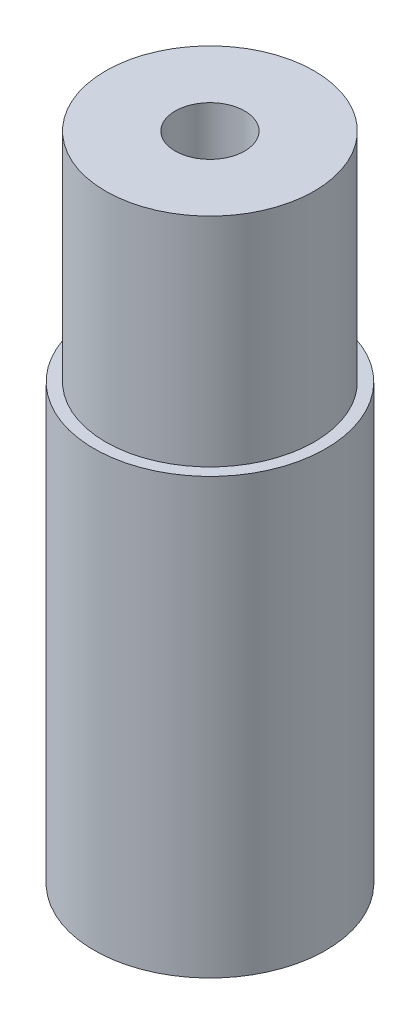
ISO-10303-21;
HEADER;
FILE_DESCRIPTION(('STEP AP214'),'2;1');
FILE_NAME('part.step','',(''),(''),'','','');
FILE_SCHEMA(('AUTOMOTIVE_DESIGN { 1 0 10303 214 1 1 1 1 }'));
ENDSEC;
DATA;
#1=APPLICATION_CONTEXT('core data for automotive mechanical design processes');
#2=APPLICATION_PROTOCOL_DEFINITION('international standard','automotive_design',2000,#1);
#3=PRODUCT_CONTEXT('',#1,'mechanical');
#4=PRODUCT('Part','Part','',(#3));
#5=PRODUCT_RELATED_PRODUCT_CATEGORY('part','',(#4));
#6=PRODUCT_DEFINITION_FORMATION('','',#4);
#7=PRODUCT_DEFINITION_CONTEXT('part definition',#1,'design');
#8=PRODUCT_DEFINITION('design','',#6,#7);
#9=PRODUCT_DEFINITION_SHAPE('','',#8);
#10=(LENGTH_UNIT() NAMED_UNIT(*) SI_UNIT(.MILLI.,.METRE.));
#11=(NAMED_UNIT(*) PLANE_ANGLE_UNIT() SI_UNIT($,.RADIAN.));
#12=(NAMED_UNIT(*) SI_UNIT($,.STERADIAN.) SOLID_ANGLE_UNIT());
#13=UNCERTAINTY_MEASURE_WITH_UNIT(LENGTH_MEASURE(1.E-05),#10,'distance_accuracy_value','');
#14=(GEOMETRIC_REPRESENTATION_CONTEXT(3) GLOBAL_UNCERTAINTY_ASSIGNED_CONTEXT((#13)) GLOBAL_UNIT_ASSIGNED_CONTEXT((#10,
#11,#12)) REPRESENTATION_CONTEXT('',''));
#15=CARTESIAN_POINT('',(0.,0.,0.));
#16=DIRECTION('',(0.,0.,1.));
#17=DIRECTION('',(1.,0.,0.));
#18=AXIS2_PLACEMENT_3D('',#15,#16,#17);
#19=CARTESIAN_POINT('',(0.,19.05,0.));
#20=DIRECTION('',(0.,-1.,0.));
#21=DIRECTION('',(0.,0.,-1.));
#22=AXIS2_PLACEMENT_3D('',#19,#20,#21);
#23=CYLINDRICAL_SURFACE('',#22,5.08);
#24=CARTESIAN_POINT('',(0.,19.05,0.));
#25=DIRECTION('',(0.,1.,0.));
#26=DIRECTION('',(0.,0.,1.));
#27=AXIS2_PLACEMENT_3D('',#24,#25,#26);
#28=CIRCLE('',#27,5.08);
#29=CARTESIAN_POINT('',(0.,19.05,-5.08));
#30=VERTEX_POINT('',#29);
#31=EDGE_CURVE('E41',#30,#30,#28,.T.);
#32=CARTESIAN_POINT('',(0.,0.,0.));
#33=DIRECTION('',(0.,1.,0.));
#34=DIRECTION('',(0.,0.,1.));
#35=AXIS2_PLACEMENT_3D('',#32,#33,#34);
#36=CIRCLE('',#35,5.08);
#37=CARTESIAN_POINT('',(0.,0.,-5.08));
#38=VERTEX_POINT('',#37);
#39=EDGE_CURVE('E37',#38,#38,#36,.T.);
#40=CARTESIAN_POINT('',(0.,19.05,-5.08));
#41=CARTESIAN_POINT('',(0.,18.8515625,-5.08));
#42=CARTESIAN_POINT('',(0.,18.653125,-5.08));
#43=CARTESIAN_POINT('',(0.,18.25625,-5.08));
#44=CARTESIAN_POINT('',(0.,18.0578125,-5.08));
#45=CARTESIAN_POINT('',(0.,17.6609375,-5.08));
#46=CARTESIAN_POINT('',(0.,17.4625,-5.08));
#47=CARTESIAN_POINT('',(0.,17.065625,-5.08));
#48=CARTESIAN_POINT('',(0.,16.8671875,-5.08));
#49=CARTESIAN_POINT('',(0.,16.4703125,-5.08));
#50=CARTESIAN_POINT('',(0.,16.271875,-5.08));
#51=CARTESIAN_POINT('',(0.,15.875,-5.08));
#52=CARTESIAN_POINT('',(0.,15.6765625,-5.08));
#53=CARTESIAN_POINT('',(0.,15.2796875,-5.08));
#54=CARTESIAN_POINT('',(0.,15.08125,-5.08));
#55=CARTESIAN_POINT('',(0.,14.684375,-5.08));
#56=CARTESIAN_POINT('',(0.,14.4859375,-5.08));
#57=CARTESIAN_POINT('',(0.,14.0890625,-5.08));
#58=CARTESIAN_POINT('',(0.,13.890625,-5.08));
#59=CARTESIAN_POINT('',(0.,13.49375,-5.08));
#60=CARTESIAN_POINT('',(0.,13.2953125,-5.08));
#61=CARTESIAN_POINT('',(0.,12.8984375,-5.08));
#62=CARTESIAN_POINT('',(0.,12.7,-5.08));
#63=CARTESIAN_POINT('',(0.,12.303125,-5.08));
#64=CARTESIAN_POINT('',(0.,12.1046875,-5.08));
#65=CARTESIAN_POINT('',(0.,11.7078125,-5.08));
#66=CARTESIAN_POINT('',(0.,11.509375,-5.08));
#67=CARTESIAN_POINT('',(0.,11.1125,-5.08));
#68=CARTESIAN_POINT('',(0.,10.9140625,-5.08));
#69=CARTESIAN_POINT('',(0.,10.5171875,-5.08));
#70=CARTESIAN_POINT('',(0.,10.31875,-5.08));
#71=CARTESIAN_POINT('',(0.,9.921875,-5.08));
#72=CARTESIAN_POINT('',(0.,9.7234375,-5.08));
#73=CARTESIAN_POINT('',(0.,9.3265625,-5.08));
#74=CARTESIAN_POINT('',(0.,9.128125,-5.08));
#75=CARTESIAN_POINT('',(0.,8.73125,-5.08));
#76=CARTESIAN_POINT('',(0.,8.5328125,-5.08));
#77=CARTESIAN_POINT('',(0.,8.1359375,-5.08));
#78=CARTESIAN_POINT('',(0.,7.9375,-5.08));
#79=CARTESIAN_POINT('',(0.,7.540625,-5.08));
#80=CARTESIAN_POINT('',(0.,7.3421875,-5.08));
#81=CARTESIAN_POINT('',(0.,6.9453125,-5.08));
#82=CARTESIAN_POINT('',(0.,6.746875,-5.08));
#83=CARTESIAN_POINT('',(0.,6.35,-5.08));
#84=CARTESIAN_POINT('',(0.,6.1515625,-5.08));
#85=CARTESIAN_POINT('',(0.,5.7546875,-5.08));
#86=CARTESIAN_POINT('',(0.,5.55625,-5.08));
#87=CARTESIAN_POINT('',(0.,5.159375,-5.08));
#88=CARTESIAN_POINT('',(0.,4.9609375,-5.08));
#89=CARTESIAN_POINT('',(0.,4.5640625,-5.08));
#90=CARTESIAN_POINT('',(0.,4.365625,-5.08));
#91=CARTESIAN_POINT('',(0.,3.96875,-5.08));
#92=CARTESIAN_POINT('',(0.,3.7703125,-5.08));
#93=CARTESIAN_POINT('',(0.,3.3734375,-5.08));
#94=CARTESIAN_POINT('',(0.,3.175,-5.08));
#95=CARTESIAN_POINT('',(0.,2.778125,-5.08));
#96=CARTESIAN_POINT('',(0.,2.5796875,-5.08));
#97=CARTESIAN_POINT('',(0.,2.1828125,-5.08));
#98=CARTESIAN_POINT('',(0.,1.984375,-5.08));
#99=CARTESIAN_POINT('',(0.,1.5875,-5.08));
#100=CARTESIAN_POINT('',(0.,1.3890625,-5.08));
#101=CARTESIAN_POINT('',(0.,0.992187500000001,-5.08));
#102=CARTESIAN_POINT('',(0.,0.793750000000001,-5.08));
#103=CARTESIAN_POINT('',(0.,0.396875,-5.08));
#104=CARTESIAN_POINT('',(0.,0.1984375,-5.08));
#105=CARTESIAN_POINT('',(0.,0.,-5.08));
#106=B_SPLINE_CURVE_WITH_KNOTS('',3,(#40,#41,#42,#43,#44,#45,#46,#47,#48,#49,#50,#51,#52,#53,
#54,#55,#56,#57,#58,#59,#60,#61,#62,#63,#64,#65,#66,#67,#68,#69,#70,#71,#72,#73,#74,#75,#76,#77,
#78,#79,#80,#81,#82,#83,#84,#85,#86,#87,#88,#89,#90,#91,#92,#93,#94,#95,#96,#97,#98,#99,#100,
#101,#102,#103,#104,#105),.UNSPECIFIED.,.F.,.F.,(4,2,2,2,2,2,2,2,2,2,2,2,2,2,2,2,2,2,2,2,2,2,2,
2,2,2,2,2,2,2,2,2,4),(0.,0.595312499999997,1.190625,1.7859375,2.38125,2.9765625,3.571875,
4.1671875,4.7625,5.3578125,5.953125,6.5484375,7.14375,7.7390625,8.334375,8.9296875,9.525,
10.1203125,10.715625,11.3109375,11.90625,12.5015625,13.096875,13.6921875,14.2875,14.8828125,
15.478125,16.0734375,16.66875,17.2640625,17.859375,18.4546875,19.05),.UNSPECIFIED.);
#107=EDGE_CURVE('BSEAM34',#30,#38,#106,.T.);
#108=ORIENTED_EDGE('',*,*,#31,.F.);
#109=ORIENTED_EDGE('',*,*,#39,.T.);
#110=ORIENTED_EDGE('',*,*,#107,.T.);
#111=ORIENTED_EDGE('',*,*,#107,.F.);
#112=EDGE_LOOP('',(#108,#110,#109,#111));
#113=FACE_BOUND('',#112,.T.);
#114=ADVANCED_FACE('F34',(#113),#23,.T.);
#115=CARTESIAN_POINT('',(0.,19.05,0.));
#116=DIRECTION('',(0.,1.,0.));
#117=DIRECTION('',(0.,0.,1.));
#118=AXIS2_PLACEMENT_3D('',#115,#116,#117);
#119=PLANE('',#118);
#120=CARTESIAN_POINT('',(0.,19.05,0.));
#121=DIRECTION('',(0.,1.,0.));
#122=DIRECTION('',(0.,0.,1.));
#123=AXIS2_PLACEMENT_3D('',#120,#121,#122);
#124=CIRCLE('',#123,4.572);
#125=CARTESIAN_POINT('',(0.,19.05,-4.572));
#126=VERTEX_POINT('',#125);
#127=EDGE_CURVE('E10',#126,#126,#124,.T.);
#128=ORIENTED_EDGE('',*,*,#127,.F.);
#129=EDGE_LOOP('',(#128));
#130=FACE_BOUND('',#129,.T.);
#131=ORIENTED_EDGE('',*,*,#31,.T.);
#132=EDGE_LOOP('',(#131));
#133=FACE_BOUND('',#132,.T.);
#134=ADVANCED_FACE('F78',(#130,#133),#119,.T.);
#135=CARTESIAN_POINT('',(0.,0.,0.));
#136=DIRECTION('',(0.,1.,0.));
#137=DIRECTION('',(0.,0.,1.));
#138=AXIS2_PLACEMENT_3D('',#135,#136,#137);
#139=PLANE('',#138);
#140=ORIENTED_EDGE('',*,*,#39,.F.);
#141=EDGE_LOOP('',(#140));
#142=FACE_BOUND('',#141,.T.);
#143=ADVANCED_FACE('F73',(#142),#139,.F.);
#144=CARTESIAN_POINT('',(0.,28.575,0.));
#145=DIRECTION('',(0.,-1.,0.));
#146=DIRECTION('',(0.,0.,-1.));
#147=AXIS2_PLACEMENT_3D('',#144,#145,#146);
#148=CYLINDRICAL_SURFACE('',#147,4.572);
#149=CARTESIAN_POINT('',(0.,28.575,0.));
#150=DIRECTION('',(0.,1.,0.));
#151=DIRECTION('',(0.,0.,1.));
#152=AXIS2_PLACEMENT_3D('',#149,#150,#151);
#153=CIRCLE('',#152,4.572);
#154=CARTESIAN_POINT('',(0.,28.575,-4.572));
#155=VERTEX_POINT('',#154);
#156=EDGE_CURVE('E47',#155,#155,#153,.T.);
#157=CARTESIAN_POINT('',(0.,28.575,-4.572));
#158=CARTESIAN_POINT('',(0.,28.47578125,-4.572));
#159=CARTESIAN_POINT('',(0.,28.3765625,-4.572));
#160=CARTESIAN_POINT('',(0.,28.178125,-4.572));
#161=CARTESIAN_POINT('',(0.,28.07890625,-4.572));
#162=CARTESIAN_POINT('',(0.,27.88046875,-4.572));
#163=CARTESIAN_POINT('',(0.,27.78125,-4.572));
#164=CARTESIAN_POINT('',(0.,27.5828125,-4.572));
#165=CARTESIAN_POINT('',(0.,27.48359375,-4.572));
#166=CARTESIAN_POINT('',(0.,27.28515625,-4.572));
#167=CARTESIAN_POINT('',(0.,27.1859375,-4.572));
#168=CARTESIAN_POINT('',(0.,26.9875,-4.572));
#169=CARTESIAN_POINT('',(0.,26.88828125,-4.572));
#170=CARTESIAN_POINT('',(0.,26.68984375,-4.572));
#171=CARTESIAN_POINT('',(0.,26.590625,-4.572));
#172=CARTESIAN_POINT('',(0.,26.3921875,-4.572));
#173=CARTESIAN_POINT('',(0.,26.29296875,-4.572));
#174=CARTESIAN_POINT('',(0.,26.09453125,-4.572));
#175=CARTESIAN_POINT('',(0.,25.9953125,-4.572));
#176=CARTESIAN_POINT('',(0.,25.796875,-4.572));
#177=CARTESIAN_POINT('',(0.,25.69765625,-4.572));
#178=CARTESIAN_POINT('',(0.,25.49921875,-4.572));
#179=CARTESIAN_POINT('',(0.,25.4,-4.572));
#180=CARTESIAN_POINT('',(0.,25.2015625,-4.572));
#181=CARTESIAN_POINT('',(0.,25.10234375,-4.572));
#182=CARTESIAN_POINT('',(0.,24.90390625,-4.572));
#183=CARTESIAN_POINT('',(0.,24.8046875,-4.572));
#184=CARTESIAN_POINT('',(0.,24.60625,-4.572));
#185=CARTESIAN_POINT('',(0.,24.50703125,-4.572));
#186=CARTESIAN_POINT('',(0.,24.30859375,-4.572));
#187=CARTESIAN_POINT('',(0.,24.209375,-4.572));
#188=CARTESIAN_POINT('',(0.,24.0109375,-4.572));
#189=CARTESIAN_POINT('',(0.,23.91171875,-4.572));
#190=CARTESIAN_POINT('',(0.,23.71328125,-4.572));
#191=CARTESIAN_POINT('',(0.,23.6140625,-4.572));
#192=CARTESIAN_POINT('',(0.,23.415625,-4.572));
#193=CARTESIAN_POINT('',(0.,23.31640625,-4.572));
#194=CARTESIAN_POINT('',(0.,23.11796875,-4.572));
#195=CARTESIAN_POINT('',(0.,23.01875,-4.572));
#196=CARTESIAN_POINT('',(0.,22.8203125,-4.572));
#197=CARTESIAN_POINT('',(0.,22.72109375,-4.572));
#198=CARTESIAN_POINT('',(0.,22.52265625,-4.572));
#199=CARTESIAN_POINT('',(0.,22.4234375,-4.572));
#200=CARTESIAN_POINT('',(0.,22.225,-4.572));
#201=CARTESIAN_POINT('',(0.,22.12578125,-4.572));
#202=CARTESIAN_POINT('',(0.,21.92734375,-4.572));
#203=CARTESIAN_POINT('',(0.,21.828125,-4.572));
#204=CARTESIAN_POINT('',(0.,21.6296875,-4.572));
#205=CARTESIAN_POINT('',(0.,21.53046875,-4.572));
#206=CARTESIAN_POINT('',(0.,21.33203125,-4.572));
#207=CARTESIAN_POINT('',(0.,21.2328125,-4.572));
#208=CARTESIAN_POINT('',(0.,21.034375,-4.572));
#209=CARTESIAN_POINT('',(0.,20.93515625,-4.572));
#210=CARTESIAN_POINT('',(0.,20.73671875,-4.572));
#211=CARTESIAN_POINT('',(0.,20.6375,-4.572));
#212=CARTESIAN_POINT('',(0.,20.4390625,-4.572));
#213=CARTESIAN_POINT('',(0.,20.33984375,-4.572));
#214=CARTESIAN_POINT('',(0.,20.14140625,-4.572));
#215=CARTESIAN_POINT('',(0.,20.0421875,-4.572));
#216=CARTESIAN_POINT('',(0.,19.84375,-4.572));
#217=CARTESIAN_POINT('',(0.,19.74453125,-4.572));
#218=CARTESIAN_POINT('',(0.,19.54609375,-4.572));
#219=CARTESIAN_POINT('',(0.,19.446875,-4.572));
#220=CARTESIAN_POINT('',(0.,19.2484375,-4.572));
#221=CARTESIAN_POINT('',(0.,19.14921875,-4.572));
#222=CARTESIAN_POINT('',(0.,19.05,-4.572));
#223=B_SPLINE_CURVE_WITH_KNOTS('',3,(#157,#158,#159,#160,#161,#162,#163,#164,#165,#166,#167,
#168,#169,#170,#171,#172,#173,#174,#175,#176,#177,#178,#179,#180,#181,#182,#183,#184,#185,#186,
#187,#188,#189,#190,#191,#192,#193,#194,#195,#196,#197,#198,#199,#200,#201,#202,#203,#204,#205,
#206,#207,#208,#209,#210,#211,#212,#213,#214,#215,#216,#217,#218,#219,#220,#221,#222),
.UNSPECIFIED.,.F.,.F.,(4,2,2,2,2,2,2,2,2,2,2,2,2,2,2,2,2,2,2,2,2,2,2,2,2,2,2,2,2,2,2,2,4),(0.,
0.297656249999997,0.595312499999997,0.892968749999997,1.190625,1.48828125,1.7859375,2.08359375,
2.38125,2.67890625,2.9765625,3.27421875,3.571875,3.86953125,4.1671875,4.46484375,4.7625,
5.06015625,5.3578125,5.65546875,5.953125,6.25078125,6.5484375,6.84609375,7.14375,7.44140625,
7.7390625,8.03671875,8.334375,8.63203125,8.9296875,9.22734375,9.525),.UNSPECIFIED.);
#224=EDGE_CURVE('BSEAM68',#155,#126,#223,.T.);
#225=ORIENTED_EDGE('',*,*,#156,.F.);
#226=ORIENTED_EDGE('',*,*,#127,.T.);
#227=ORIENTED_EDGE('',*,*,#224,.T.);
#228=ORIENTED_EDGE('',*,*,#224,.F.);
#229=EDGE_LOOP('',(#225,#227,#226,#228));
#230=FACE_BOUND('',#229,.T.);
#231=ADVANCED_FACE('F68',(#230),#148,.T.);
#232=CARTESIAN_POINT('',(0.,28.575,0.));
#233=DIRECTION('',(0.,1.,0.));
#234=DIRECTION('',(0.,0.,1.));
#235=AXIS2_PLACEMENT_3D('',#232,#233,#234);
#236=PLANE('',#235);
#237=CARTESIAN_POINT('',(0.,28.575,0.));
#238=DIRECTION('',(0.,1.,0.));
#239=DIRECTION('',(0.,0.,1.));
#240=AXIS2_PLACEMENT_3D('',#237,#238,#239);
#241=CIRCLE('',#240,1.524);
#242=CARTESIAN_POINT('',(0.,28.575,1.524));
#243=VERTEX_POINT('',#242);
#244=EDGE_CURVE('E51',#243,#243,#241,.T.);
#245=ORIENTED_EDGE('',*,*,#244,.F.);
#246=EDGE_LOOP('',(#245));
#247=FACE_BOUND('',#246,.T.);
#248=ORIENTED_EDGE('',*,*,#156,.T.);
#249=EDGE_LOOP('',(#248));
#250=FACE_BOUND('',#249,.T.);
#251=ADVANCED_FACE('F62',(#247,#250),#236,.T.);
#252=CARTESIAN_POINT('',(0.,23.876,0.));
#253=DIRECTION('',(0.,1.,0.));
#254=DIRECTION('',(0.,0.,1.));
#255=AXIS2_PLACEMENT_3D('',#252,#253,#254);
#256=CYLINDRICAL_SURFACE('',#255,1.524);
#257=CARTESIAN_POINT('',(0.,23.876,0.));
#258=DIRECTION('',(0.,1.,0.));
#259=DIRECTION('',(0.,0.,1.));
#260=AXIS2_PLACEMENT_3D('',#257,#258,#259);
#261=CIRCLE('',#260,1.524);
#262=CARTESIAN_POINT('',(0.,23.876,1.524));
#263=VERTEX_POINT('',#262);
#264=EDGE_CURVE('E50',#263,#263,#261,.T.);
#265=ORIENTED_EDGE('',*,*,#264,.F.);
#266=EDGE_LOOP('',(#265));
#267=FACE_BOUND('',#266,.T.);
#268=ORIENTED_EDGE('',*,*,#244,.T.);
#269=EDGE_LOOP('',(#268));
#270=FACE_BOUND('',#269,.T.);
#271=ADVANCED_FACE('F59',(#267,#270),#256,.F.);
#272=CARTESIAN_POINT('',(0.,23.876,0.));
#273=DIRECTION('',(0.,1.,0.));
#274=DIRECTION('',(0.,0.,1.));
#275=AXIS2_PLACEMENT_3D('',#272,#273,#274);
#276=PLANE('',#275);
#277=ORIENTED_EDGE('',*,*,#264,.T.);
#278=EDGE_LOOP('',(#277));
#279=FACE_BOUND('',#278,.T.);
#280=ADVANCED_FACE('F57',(#279),#276,.T.);
#281=CLOSED_SHELL('',(#114,#134,#143,#231,#251,#271,#280));
#282=MANIFOLD_SOLID_BREP('B2',#281);
#283=ADVANCED_BREP_SHAPE_REPRESENTATION('',(#18,#282),#14);
#284=SHAPE_DEFINITION_REPRESENTATION(#9,#283);
ENDSEC;
END-ISO-10303-21;
